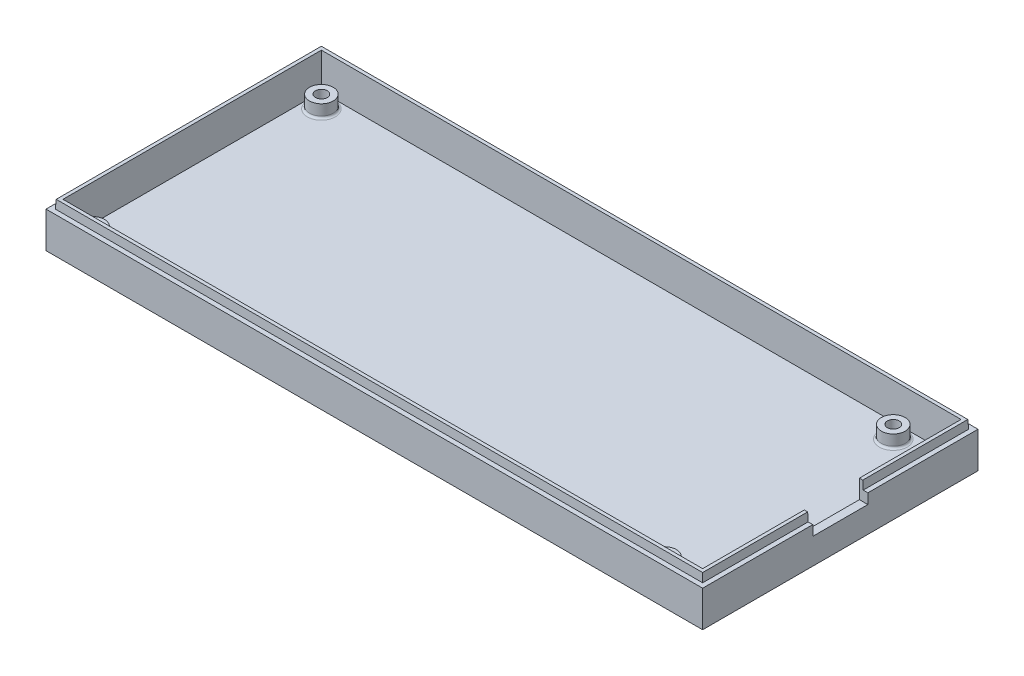
ISO-10303-21;
HEADER;
FILE_DESCRIPTION(('STEP AP214'),'2;1');
FILE_NAME('part.step','',(''),(''),'','','');
FILE_SCHEMA(('AUTOMOTIVE_DESIGN { 1 0 10303 214 1 1 1 1 }'));
ENDSEC;
DATA;
#1=APPLICATION_CONTEXT('core data for automotive mechanical design processes');
#2=APPLICATION_PROTOCOL_DEFINITION('international standard','automotive_design',2000,#1);
#3=PRODUCT_CONTEXT('',#1,'mechanical');
#4=PRODUCT('Part','Part','',(#3));
#5=PRODUCT_RELATED_PRODUCT_CATEGORY('part','',(#4));
#6=PRODUCT_DEFINITION_FORMATION('','',#4);
#7=PRODUCT_DEFINITION_CONTEXT('part definition',#1,'design');
#8=PRODUCT_DEFINITION('design','',#6,#7);
#9=PRODUCT_DEFINITION_SHAPE('','',#8);
#10=(LENGTH_UNIT() NAMED_UNIT(*) SI_UNIT(.MILLI.,.METRE.));
#11=(NAMED_UNIT(*) PLANE_ANGLE_UNIT() SI_UNIT($,.RADIAN.));
#12=(NAMED_UNIT(*) SI_UNIT($,.STERADIAN.) SOLID_ANGLE_UNIT());
#13=UNCERTAINTY_MEASURE_WITH_UNIT(LENGTH_MEASURE(1.E-05),#10,'distance_accuracy_value','');
#14=(GEOMETRIC_REPRESENTATION_CONTEXT(3) GLOBAL_UNCERTAINTY_ASSIGNED_CONTEXT((#13)) GLOBAL_UNIT_ASSIGNED_CONTEXT((#10,
#11,#12)) REPRESENTATION_CONTEXT('',''));
#15=CARTESIAN_POINT('',(0.,0.,0.));
#16=DIRECTION('',(0.,0.,1.));
#17=DIRECTION('',(1.,0.,0.));
#18=AXIS2_PLACEMENT_3D('',#15,#16,#17);
#19=CARTESIAN_POINT('',(0.,6.5,0.));
#20=DIRECTION('',(0.,-1.,0.));
#21=DIRECTION('',(0.,0.,-1.));
#22=AXIS2_PLACEMENT_3D('',#19,#20,#21);
#23=PLANE('',#22);
#24=DIRECTION('',(1.,0.,0.));
#25=VECTOR('',#24,1.);
#26=CARTESIAN_POINT('',(-77.501,6.5,6.49999999999998));
#27=LINE('',#26,#25);
#28=CARTESIAN_POINT('',(76.4,6.5,6.49999999999998));
#29=VERTEX_POINT('',#28);
#30=CARTESIAN_POINT('',(77.5,6.5,6.49999999999998));
#31=VERTEX_POINT('',#30);
#32=EDGE_CURVE('E44',#29,#31,#27,.T.);
#33=ORIENTED_EDGE('',*,*,#32,.F.);
#34=DIRECTION('',(0.,0.,1.));
#35=VECTOR('',#34,1.);
#36=CARTESIAN_POINT('',(76.4,6.5,0.));
#37=LINE('',#36,#35);
#38=CARTESIAN_POINT('',(76.4,6.5,31.4));
#39=VERTEX_POINT('',#38);
#40=EDGE_CURVE('E184',#29,#39,#37,.T.);
#41=ORIENTED_EDGE('',*,*,#40,.T.);
#42=DIRECTION('',(-1.,0.,0.));
#43=VECTOR('',#42,1.);
#44=CARTESIAN_POINT('',(0.,6.5,31.4));
#45=LINE('',#44,#43);
#46=CARTESIAN_POINT('',(-76.4,6.5,31.4));
#47=VERTEX_POINT('',#46);
#48=EDGE_CURVE('E222',#39,#47,#45,.T.);
#49=ORIENTED_EDGE('',*,*,#48,.T.);
#50=DIRECTION('',(0.,0.,-1.));
#51=VECTOR('',#50,1.);
#52=CARTESIAN_POINT('',(-76.4,6.5,0.));
#53=LINE('',#52,#51);
#54=CARTESIAN_POINT('',(-76.4,6.5,-31.4));
#55=VERTEX_POINT('',#54);
#56=EDGE_CURVE('E226',#47,#55,#53,.T.);
#57=ORIENTED_EDGE('',*,*,#56,.T.);
#58=DIRECTION('',(1.,0.,0.));
#59=VECTOR('',#58,1.);
#60=CARTESIAN_POINT('',(0.,6.5,-31.4));
#61=LINE('',#60,#59);
#62=CARTESIAN_POINT('',(76.4,6.5,-31.4));
#63=VERTEX_POINT('',#62);
#64=EDGE_CURVE('E207',#55,#63,#61,.T.);
#65=ORIENTED_EDGE('',*,*,#64,.T.);
#66=DIRECTION('',(0.,0.,1.));
#67=VECTOR('',#66,1.);
#68=CARTESIAN_POINT('',(76.4,6.5,0.));
#69=LINE('',#68,#67);
#70=CARTESIAN_POINT('',(76.4,6.5,-6.50000000000002));
#71=VERTEX_POINT('',#70);
#72=EDGE_CURVE('E210',#63,#71,#69,.T.);
#73=ORIENTED_EDGE('',*,*,#72,.T.);
#74=DIRECTION('',(1.,0.,0.));
#75=VECTOR('',#74,1.);
#76=CARTESIAN_POINT('',(-77.501,6.5,-6.50000000000002));
#77=LINE('',#76,#75);
#78=CARTESIAN_POINT('',(77.5,6.5,-6.50000000000002));
#79=VERTEX_POINT('',#78);
#80=EDGE_CURVE('E12',#71,#79,#77,.T.);
#81=ORIENTED_EDGE('',*,*,#80,.T.);
#82=DIRECTION('',(0.,0.,1.));
#83=VECTOR('',#82,1.);
#84=CARTESIAN_POINT('',(77.5,6.5,-30.5));
#85=LINE('',#84,#83);
#86=CARTESIAN_POINT('',(77.5,6.5,-32.5));
#87=VERTEX_POINT('',#86);
#88=EDGE_CURVE('E376',#87,#79,#85,.T.);
#89=ORIENTED_EDGE('',*,*,#88,.F.);
#90=DIRECTION('',(1.,0.,0.));
#91=VECTOR('',#90,1.);
#92=CARTESIAN_POINT('',(-75.5,6.5,-32.5));
#93=LINE('',#92,#91);
#94=CARTESIAN_POINT('',(-77.5,6.5,-32.5));
#95=VERTEX_POINT('',#94);
#96=EDGE_CURVE('E380',#95,#87,#93,.T.);
#97=ORIENTED_EDGE('',*,*,#96,.F.);
#98=DIRECTION('',(0.,0.,-1.));
#99=VECTOR('',#98,1.);
#100=CARTESIAN_POINT('',(-77.5,6.5,-30.5));
#101=LINE('',#100,#99);
#102=CARTESIAN_POINT('',(-77.5,6.5,32.5));
#103=VERTEX_POINT('',#102);
#104=EDGE_CURVE('E366',#103,#95,#101,.T.);
#105=ORIENTED_EDGE('',*,*,#104,.F.);
#106=DIRECTION('',(-1.,0.,0.));
#107=VECTOR('',#106,1.);
#108=CARTESIAN_POINT('',(-75.5,6.5,32.5));
#109=LINE('',#108,#107);
#110=CARTESIAN_POINT('',(77.5,6.5,32.5));
#111=VERTEX_POINT('',#110);
#112=EDGE_CURVE('E363',#111,#103,#109,.T.);
#113=ORIENTED_EDGE('',*,*,#112,.F.);
#114=EDGE_CURVE('E379',#31,#111,#85,.T.);
#115=ORIENTED_EDGE('',*,*,#114,.F.);
#116=EDGE_LOOP('',(#33,#41,#49,#57,#65,#73,#81,#89,#97,#105,#113,#115));
#117=FACE_BOUND('',#116,.T.);
#118=ADVANCED_FACE('F36',(#117),#23,.F.);
#119=CARTESIAN_POINT('',(0.,0.,0.));
#120=DIRECTION('',(0.,1.,0.));
#121=DIRECTION('',(0.,0.,1.));
#122=AXIS2_PLACEMENT_3D('',#119,#120,#121);
#123=PLANE('',#122);
#124=CARTESIAN_POINT('',(-72.,0.,-27.));
#125=DIRECTION('',(0.,1.,0.));
#126=DIRECTION('',(0.,0.,1.));
#127=AXIS2_PLACEMENT_3D('',#124,#125,#126);
#128=CIRCLE('',#127,1.4);
#129=CARTESIAN_POINT('',(-72.,0.,-25.6));
#130=VERTEX_POINT('',#129);
#131=EDGE_CURVE('E290',#130,#130,#128,.F.);
#132=ORIENTED_EDGE('',*,*,#131,.F.);
#133=EDGE_LOOP('',(#132));
#134=FACE_BOUND('',#133,.T.);
#135=ADVANCED_FACE('F456',(#134),#123,.T.);
#136=CARTESIAN_POINT('',(0.,0.,0.));
#137=DIRECTION('',(0.,1.,0.));
#138=DIRECTION('',(0.,0.,1.));
#139=AXIS2_PLACEMENT_3D('',#136,#137,#138);
#140=PLANE('',#139);
#141=CARTESIAN_POINT('',(63.,0.,-27.));
#142=DIRECTION('',(0.,1.,0.));
#143=DIRECTION('',(0.,0.,1.));
#144=AXIS2_PLACEMENT_3D('',#141,#142,#143);
#145=CIRCLE('',#144,1.4);
#146=CARTESIAN_POINT('',(63.,0.,-25.6));
#147=VERTEX_POINT('',#146);
#148=EDGE_CURVE('E273',#147,#147,#145,.F.);
#149=ORIENTED_EDGE('',*,*,#148,.F.);
#150=EDGE_LOOP('',(#149));
#151=FACE_BOUND('',#150,.T.);
#152=ADVANCED_FACE('F462',(#151),#140,.T.);
#153=CARTESIAN_POINT('',(0.,0.,0.));
#154=DIRECTION('',(0.,1.,0.));
#155=DIRECTION('',(0.,0.,1.));
#156=AXIS2_PLACEMENT_3D('',#153,#154,#155);
#157=PLANE('',#156);
#158=CARTESIAN_POINT('',(63.,0.,27.));
#159=DIRECTION('',(0.,1.,0.));
#160=DIRECTION('',(0.,0.,1.));
#161=AXIS2_PLACEMENT_3D('',#158,#159,#160);
#162=CIRCLE('',#161,1.4);
#163=CARTESIAN_POINT('',(63.,0.,28.4));
#164=VERTEX_POINT('',#163);
#165=EDGE_CURVE('E274',#164,#164,#162,.F.);
#166=ORIENTED_EDGE('',*,*,#165,.F.);
#167=EDGE_LOOP('',(#166));
#168=FACE_BOUND('',#167,.T.);
#169=ADVANCED_FACE('F680',(#168),#157,.T.);
#170=CARTESIAN_POINT('',(0.,0.,0.));
#171=DIRECTION('',(0.,1.,0.));
#172=DIRECTION('',(0.,0.,1.));
#173=AXIS2_PLACEMENT_3D('',#170,#171,#172);
#174=PLANE('',#173);
#175=CARTESIAN_POINT('',(-72.,0.,27.));
#176=DIRECTION('',(0.,1.,0.));
#177=DIRECTION('',(0.,0.,1.));
#178=AXIS2_PLACEMENT_3D('',#175,#176,#177);
#179=CIRCLE('',#178,1.4);
#180=CARTESIAN_POINT('',(-72.,0.,28.4));
#181=VERTEX_POINT('',#180);
#182=EDGE_CURVE('E281',#181,#181,#179,.F.);
#183=ORIENTED_EDGE('',*,*,#182,.F.);
#184=EDGE_LOOP('',(#183));
#185=FACE_BOUND('',#184,.T.);
#186=ADVANCED_FACE('F692',(#185),#174,.T.);
#187=CARTESIAN_POINT('',(-72.,-3.95979797464467,-27.));
#188=DIRECTION('',(0.,1.,0.));
#189=DIRECTION('',(0.,0.,1.));
#190=AXIS2_PLACEMENT_3D('',#187,#188,#189);
#191=CYLINDRICAL_SURFACE('',#190,1.4);
#192=ORIENTED_EDGE('',*,*,#131,.T.);
#193=EDGE_LOOP('',(#192));
#194=FACE_BOUND('',#193,.T.);
#195=CARTESIAN_POINT('',(-72.,3.,-27.));
#196=DIRECTION('',(0.,1.,0.));
#197=DIRECTION('',(0.,0.,1.));
#198=AXIS2_PLACEMENT_3D('',#195,#196,#197);
#199=CIRCLE('',#198,1.4);
#200=CARTESIAN_POINT('',(-72.,3.,-25.6));
#201=VERTEX_POINT('',#200);
#202=EDGE_CURVE('E277',#201,#201,#199,.T.);
#203=ORIENTED_EDGE('',*,*,#202,.T.);
#204=EDGE_LOOP('',(#203));
#205=FACE_BOUND('',#204,.T.);
#206=ADVANCED_FACE('F531',(#194,#205),#191,.F.);
#207=CARTESIAN_POINT('',(63.,-3.95979797464467,-27.));
#208=DIRECTION('',(0.,1.,0.));
#209=DIRECTION('',(0.,0.,1.));
#210=AXIS2_PLACEMENT_3D('',#207,#208,#209);
#211=CYLINDRICAL_SURFACE('',#210,1.4);
#212=ORIENTED_EDGE('',*,*,#148,.T.);
#213=EDGE_LOOP('',(#212));
#214=FACE_BOUND('',#213,.T.);
#215=CARTESIAN_POINT('',(63.,3.,-27.));
#216=DIRECTION('',(0.,1.,0.));
#217=DIRECTION('',(0.,0.,1.));
#218=AXIS2_PLACEMENT_3D('',#215,#216,#217);
#219=CIRCLE('',#218,1.4);
#220=CARTESIAN_POINT('',(63.,3.,-25.6));
#221=VERTEX_POINT('',#220);
#222=EDGE_CURVE('E270',#221,#221,#219,.T.);
#223=ORIENTED_EDGE('',*,*,#222,.T.);
#224=EDGE_LOOP('',(#223));
#225=FACE_BOUND('',#224,.T.);
#226=ADVANCED_FACE('F691',(#214,#225),#211,.F.);
#227=CARTESIAN_POINT('',(63.,-3.95979797464467,27.));
#228=DIRECTION('',(0.,1.,0.));
#229=DIRECTION('',(0.,0.,1.));
#230=AXIS2_PLACEMENT_3D('',#227,#228,#229);
#231=CYLINDRICAL_SURFACE('',#230,1.4);
#232=ORIENTED_EDGE('',*,*,#165,.T.);
#233=EDGE_LOOP('',(#232));
#234=FACE_BOUND('',#233,.T.);
#235=CARTESIAN_POINT('',(63.,3.,27.));
#236=DIRECTION('',(0.,1.,0.));
#237=DIRECTION('',(0.,0.,1.));
#238=AXIS2_PLACEMENT_3D('',#235,#236,#237);
#239=CIRCLE('',#238,1.4);
#240=CARTESIAN_POINT('',(63.,3.,28.4));
#241=VERTEX_POINT('',#240);
#242=EDGE_CURVE('E278',#241,#241,#239,.T.);
#243=ORIENTED_EDGE('',*,*,#242,.T.);
#244=EDGE_LOOP('',(#243));
#245=FACE_BOUND('',#244,.T.);
#246=ADVANCED_FACE('F526',(#234,#245),#231,.F.);
#247=CARTESIAN_POINT('',(-72.,-3.95979797464467,27.));
#248=DIRECTION('',(0.,1.,0.));
#249=DIRECTION('',(0.,0.,1.));
#250=AXIS2_PLACEMENT_3D('',#247,#248,#249);
#251=CYLINDRICAL_SURFACE('',#250,1.4);
#252=ORIENTED_EDGE('',*,*,#182,.T.);
#253=EDGE_LOOP('',(#252));
#254=FACE_BOUND('',#253,.T.);
#255=CARTESIAN_POINT('',(-72.,3.,27.));
#256=DIRECTION('',(0.,1.,0.));
#257=DIRECTION('',(0.,0.,1.));
#258=AXIS2_PLACEMENT_3D('',#255,#256,#257);
#259=CIRCLE('',#258,1.4);
#260=CARTESIAN_POINT('',(-72.,3.,28.4));
#261=VERTEX_POINT('',#260);
#262=EDGE_CURVE('E254',#261,#261,#259,.T.);
#263=ORIENTED_EDGE('',*,*,#262,.T.);
#264=EDGE_LOOP('',(#263));
#265=FACE_BOUND('',#264,.T.);
#266=ADVANCED_FACE('F516',(#254,#265),#251,.F.);
#267=CARTESIAN_POINT('',(-72.,3.,-27.));
#268=DIRECTION('',(0.,1.,0.));
#269=DIRECTION('',(0.,0.,1.));
#270=AXIS2_PLACEMENT_3D('',#267,#268,#269);
#271=PLANE('',#270);
#272=ORIENTED_EDGE('',*,*,#202,.F.);
#273=EDGE_LOOP('',(#272));
#274=FACE_BOUND('',#273,.T.);
#275=CARTESIAN_POINT('',(-72.,3.,-27.));
#276=DIRECTION('',(0.,1.,0.));
#277=DIRECTION('',(0.,0.,1.));
#278=AXIS2_PLACEMENT_3D('',#275,#276,#277);
#279=CIRCLE('',#278,2.80000000000001);
#280=CARTESIAN_POINT('',(-72.,3.,-24.2));
#281=VERTEX_POINT('',#280);
#282=EDGE_CURVE('E293',#281,#281,#279,.T.);
#283=ORIENTED_EDGE('',*,*,#282,.T.);
#284=EDGE_LOOP('',(#283));
#285=FACE_BOUND('',#284,.T.);
#286=ADVANCED_FACE('F513',(#274,#285),#271,.T.);
#287=CARTESIAN_POINT('',(63.,3.,-27.));
#288=DIRECTION('',(0.,1.,0.));
#289=DIRECTION('',(0.,0.,1.));
#290=AXIS2_PLACEMENT_3D('',#287,#288,#289);
#291=PLANE('',#290);
#292=ORIENTED_EDGE('',*,*,#222,.F.);
#293=EDGE_LOOP('',(#292));
#294=FACE_BOUND('',#293,.T.);
#295=CARTESIAN_POINT('',(63.,3.,-27.));
#296=DIRECTION('',(0.,1.,0.));
#297=DIRECTION('',(0.,0.,1.));
#298=AXIS2_PLACEMENT_3D('',#295,#296,#297);
#299=CIRCLE('',#298,2.80000000000001);
#300=CARTESIAN_POINT('',(63.,3.,-24.2));
#301=VERTEX_POINT('',#300);
#302=EDGE_CURVE('E302',#301,#301,#299,.T.);
#303=ORIENTED_EDGE('',*,*,#302,.T.);
#304=EDGE_LOOP('',(#303));
#305=FACE_BOUND('',#304,.T.);
#306=ADVANCED_FACE('F515',(#294,#305),#291,.T.);
#307=CARTESIAN_POINT('',(63.,3.,27.));
#308=DIRECTION('',(0.,-1.,0.));
#309=DIRECTION('',(0.,0.,-1.));
#310=AXIS2_PLACEMENT_3D('',#307,#308,#309);
#311=PLANE('',#310);
#312=ORIENTED_EDGE('',*,*,#242,.F.);
#313=EDGE_LOOP('',(#312));
#314=FACE_BOUND('',#313,.T.);
#315=CARTESIAN_POINT('',(63.,3.,27.));
#316=DIRECTION('',(0.,1.,0.));
#317=DIRECTION('',(0.,0.,-1.));
#318=AXIS2_PLACEMENT_3D('',#315,#316,#317);
#319=CIRCLE('',#318,2.80000000000001);
#320=CARTESIAN_POINT('',(63.,3.,24.2));
#321=VERTEX_POINT('',#320);
#322=EDGE_CURVE('E299',#321,#321,#319,.T.);
#323=ORIENTED_EDGE('',*,*,#322,.T.);
#324=EDGE_LOOP('',(#323));
#325=FACE_BOUND('',#324,.T.);
#326=ADVANCED_FACE('F523',(#314,#325),#311,.F.);
#327=CARTESIAN_POINT('',(-72.,3.,27.));
#328=DIRECTION('',(0.,-1.,0.));
#329=DIRECTION('',(0.,0.,-1.));
#330=AXIS2_PLACEMENT_3D('',#327,#328,#329);
#331=PLANE('',#330);
#332=ORIENTED_EDGE('',*,*,#262,.F.);
#333=EDGE_LOOP('',(#332));
#334=FACE_BOUND('',#333,.T.);
#335=CARTESIAN_POINT('',(-72.,3.,27.));
#336=DIRECTION('',(0.,1.,0.));
#337=DIRECTION('',(0.,0.,-1.));
#338=AXIS2_PLACEMENT_3D('',#335,#336,#337);
#339=CIRCLE('',#338,2.80000000000001);
#340=CARTESIAN_POINT('',(-72.,3.,24.2));
#341=VERTEX_POINT('',#340);
#342=EDGE_CURVE('E296',#341,#341,#339,.T.);
#343=ORIENTED_EDGE('',*,*,#342,.T.);
#344=EDGE_LOOP('',(#343));
#345=FACE_BOUND('',#344,.T.);
#346=ADVANCED_FACE('F509',(#334,#345),#331,.F.);
#347=CARTESIAN_POINT('',(-72.,3.,-27.));
#348=DIRECTION('',(0.,-1.,0.));
#349=DIRECTION('',(0.,0.,-1.));
#350=AXIS2_PLACEMENT_3D('',#347,#348,#349);
#351=CYLINDRICAL_SURFACE('',#350,2.80000000000001);
#352=CARTESIAN_POINT('',(-72.,0.5,-27.));
#353=DIRECTION('',(0.,1.,0.));
#354=DIRECTION('',(0.,0.,1.));
#355=AXIS2_PLACEMENT_3D('',#352,#353,#354);
#356=CIRCLE('',#355,2.80000000000001);
#357=CARTESIAN_POINT('',(-72.,0.5,-24.2));
#358=VERTEX_POINT('',#357);
#359=EDGE_CURVE('E360',#358,#358,#356,.T.);
#360=ORIENTED_EDGE('',*,*,#359,.T.);
#361=EDGE_LOOP('',(#360));
#362=FACE_BOUND('',#361,.T.);
#363=ORIENTED_EDGE('',*,*,#282,.F.);
#364=EDGE_LOOP('',(#363));
#365=FACE_BOUND('',#364,.T.);
#366=ADVANCED_FACE('F505',(#362,#365),#351,.T.);
#367=CARTESIAN_POINT('',(63.,3.,-27.));
#368=DIRECTION('',(0.,-1.,0.));
#369=DIRECTION('',(0.,0.,-1.));
#370=AXIS2_PLACEMENT_3D('',#367,#368,#369);
#371=CYLINDRICAL_SURFACE('',#370,2.80000000000001);
#372=CARTESIAN_POINT('',(63.,0.5,-27.));
#373=DIRECTION('',(0.,1.,0.));
#374=DIRECTION('',(0.,0.,1.));
#375=AXIS2_PLACEMENT_3D('',#372,#373,#374);
#376=CIRCLE('',#375,2.80000000000001);
#377=CARTESIAN_POINT('',(63.,0.5,-24.2));
#378=VERTEX_POINT('',#377);
#379=EDGE_CURVE('E357',#378,#378,#376,.T.);
#380=ORIENTED_EDGE('',*,*,#379,.T.);
#381=EDGE_LOOP('',(#380));
#382=FACE_BOUND('',#381,.T.);
#383=ORIENTED_EDGE('',*,*,#302,.F.);
#384=EDGE_LOOP('',(#383));
#385=FACE_BOUND('',#384,.T.);
#386=ADVANCED_FACE('F508',(#382,#385),#371,.T.);
#387=CARTESIAN_POINT('',(63.,3.,27.));
#388=DIRECTION('',(0.,-1.,0.));
#389=DIRECTION('',(0.,0.,-1.));
#390=AXIS2_PLACEMENT_3D('',#387,#388,#389);
#391=CYLINDRICAL_SURFACE('',#390,2.80000000000001);
#392=CARTESIAN_POINT('',(63.,0.5,27.));
#393=DIRECTION('',(0.,1.,0.));
#394=DIRECTION('',(0.,0.,1.));
#395=AXIS2_PLACEMENT_3D('',#392,#393,#394);
#396=CIRCLE('',#395,2.80000000000001);
#397=CARTESIAN_POINT('',(63.,0.5,29.8));
#398=VERTEX_POINT('',#397);
#399=EDGE_CURVE('E354',#398,#398,#396,.T.);
#400=ORIENTED_EDGE('',*,*,#399,.T.);
#401=EDGE_LOOP('',(#400));
#402=FACE_BOUND('',#401,.T.);
#403=ORIENTED_EDGE('',*,*,#322,.F.);
#404=EDGE_LOOP('',(#403));
#405=FACE_BOUND('',#404,.T.);
#406=ADVANCED_FACE('F498',(#402,#405),#391,.T.);
#407=CARTESIAN_POINT('',(-72.,3.,27.));
#408=DIRECTION('',(0.,-1.,0.));
#409=DIRECTION('',(0.,0.,-1.));
#410=AXIS2_PLACEMENT_3D('',#407,#408,#409);
#411=CYLINDRICAL_SURFACE('',#410,2.80000000000001);
#412=CARTESIAN_POINT('',(-72.,0.5,27.));
#413=DIRECTION('',(0.,1.,0.));
#414=DIRECTION('',(0.,0.,1.));
#415=AXIS2_PLACEMENT_3D('',#412,#413,#414);
#416=CIRCLE('',#415,2.80000000000001);
#417=CARTESIAN_POINT('',(-72.,0.5,29.8));
#418=VERTEX_POINT('',#417);
#419=EDGE_CURVE('E328',#418,#418,#416,.T.);
#420=ORIENTED_EDGE('',*,*,#419,.T.);
#421=EDGE_LOOP('',(#420));
#422=FACE_BOUND('',#421,.T.);
#423=ORIENTED_EDGE('',*,*,#342,.F.);
#424=EDGE_LOOP('',(#423));
#425=FACE_BOUND('',#424,.T.);
#426=ADVANCED_FACE('F493',(#422,#425),#411,.T.);
#427=CARTESIAN_POINT('',(-72.,0.5,-27.));
#428=DIRECTION('',(0.,1.,0.));
#429=DIRECTION('',(0.,0.,1.));
#430=AXIS2_PLACEMENT_3D('',#427,#428,#429);
#431=TOROIDAL_SURFACE('',#430,3.30000000000001,0.5);
#432=CARTESIAN_POINT('',(-72.,0.,-27.));
#433=DIRECTION('',(0.,1.,0.));
#434=DIRECTION('',(0.,0.,1.));
#435=AXIS2_PLACEMENT_3D('',#432,#433,#434);
#436=CIRCLE('',#435,3.30000000000001);
#437=CARTESIAN_POINT('',(-72.,0.,-23.7));
#438=VERTEX_POINT('',#437);
#439=EDGE_CURVE('E342',#438,#438,#436,.F.);
#440=ORIENTED_EDGE('',*,*,#439,.F.);
#441=EDGE_LOOP('',(#440));
#442=FACE_BOUND('',#441,.T.);
#443=ORIENTED_EDGE('',*,*,#359,.F.);
#444=EDGE_LOOP('',(#443));
#445=FACE_BOUND('',#444,.T.);
#446=ADVANCED_FACE('F490',(#442,#445),#431,.F.);
#447=CARTESIAN_POINT('',(63.,0.5,-27.));
#448=DIRECTION('',(0.,1.,0.));
#449=DIRECTION('',(0.,0.,1.));
#450=AXIS2_PLACEMENT_3D('',#447,#448,#449);
#451=TOROIDAL_SURFACE('',#450,3.30000000000001,0.5);
#452=CARTESIAN_POINT('',(63.,0.,-27.));
#453=DIRECTION('',(0.,1.,0.));
#454=DIRECTION('',(0.,0.,1.));
#455=AXIS2_PLACEMENT_3D('',#452,#453,#454);
#456=CIRCLE('',#455,3.30000000000001);
#457=CARTESIAN_POINT('',(63.,0.,-23.7));
#458=VERTEX_POINT('',#457);
#459=EDGE_CURVE('E345',#458,#458,#456,.F.);
#460=ORIENTED_EDGE('',*,*,#459,.F.);
#461=EDGE_LOOP('',(#460));
#462=FACE_BOUND('',#461,.T.);
#463=ORIENTED_EDGE('',*,*,#379,.F.);
#464=EDGE_LOOP('',(#463));
#465=FACE_BOUND('',#464,.T.);
#466=ADVANCED_FACE('F487',(#462,#465),#451,.F.);
#467=CARTESIAN_POINT('',(63.,0.5,27.));
#468=DIRECTION('',(0.,1.,0.));
#469=DIRECTION('',(0.,0.,1.));
#470=AXIS2_PLACEMENT_3D('',#467,#468,#469);
#471=TOROIDAL_SURFACE('',#470,3.30000000000001,0.5);
#472=CARTESIAN_POINT('',(63.,0.,27.));
#473=DIRECTION('',(0.,1.,0.));
#474=DIRECTION('',(0.,0.,1.));
#475=AXIS2_PLACEMENT_3D('',#472,#473,#474);
#476=CIRCLE('',#475,3.30000000000001);
#477=CARTESIAN_POINT('',(63.,0.,30.3));
#478=VERTEX_POINT('',#477);
#479=EDGE_CURVE('E348',#478,#478,#476,.F.);
#480=ORIENTED_EDGE('',*,*,#479,.F.);
#481=EDGE_LOOP('',(#480));
#482=FACE_BOUND('',#481,.T.);
#483=ORIENTED_EDGE('',*,*,#399,.F.);
#484=EDGE_LOOP('',(#483));
#485=FACE_BOUND('',#484,.T.);
#486=ADVANCED_FACE('F483',(#482,#485),#471,.F.);
#487=CARTESIAN_POINT('',(-72.,0.5,27.));
#488=DIRECTION('',(0.,1.,0.));
#489=DIRECTION('',(0.,0.,1.));
#490=AXIS2_PLACEMENT_3D('',#487,#488,#489);
#491=TOROIDAL_SURFACE('',#490,3.30000000000001,0.5);
#492=CARTESIAN_POINT('',(-72.,0.,27.));
#493=DIRECTION('',(0.,1.,0.));
#494=DIRECTION('',(0.,0.,1.));
#495=AXIS2_PLACEMENT_3D('',#492,#493,#494);
#496=CIRCLE('',#495,3.30000000000001);
#497=CARTESIAN_POINT('',(-72.,0.,30.3));
#498=VERTEX_POINT('',#497);
#499=EDGE_CURVE('E351',#498,#498,#496,.F.);
#500=ORIENTED_EDGE('',*,*,#499,.F.);
#501=EDGE_LOOP('',(#500));
#502=FACE_BOUND('',#501,.T.);
#503=ORIENTED_EDGE('',*,*,#419,.F.);
#504=EDGE_LOOP('',(#503));
#505=FACE_BOUND('',#504,.T.);
#506=ADVANCED_FACE('F480',(#502,#505),#491,.F.);
#507=CARTESIAN_POINT('',(-75.5,13.,-30.5));
#508=DIRECTION('',(0.,0.,1.));
#509=DIRECTION('',(1.,0.,0.));
#510=AXIS2_PLACEMENT_3D('',#507,#508,#509);
#511=PLANE('',#510);
#512=DIRECTION('',(0.,-1.,0.));
#513=VECTOR('',#512,1.);
#514=CARTESIAN_POINT('',(75.5,13.,-30.5));
#515=LINE('',#514,#513);
#516=CARTESIAN_POINT('',(75.5,8.5,-30.5));
#517=VERTEX_POINT('',#516);
#518=CARTESIAN_POINT('',(75.5,0.,-30.5));
#519=VERTEX_POINT('',#518);
#520=EDGE_CURVE('E162',#517,#519,#515,.T.);
#521=ORIENTED_EDGE('',*,*,#520,.F.);
#522=DIRECTION('',(1.,0.,0.));
#523=VECTOR('',#522,1.);
#524=CARTESIAN_POINT('',(-75.5,8.5,-30.5));
#525=LINE('',#524,#523);
#526=CARTESIAN_POINT('',(-75.5,8.5,-30.5));
#527=VERTEX_POINT('',#526);
#528=EDGE_CURVE('E165',#527,#517,#525,.T.);
#529=ORIENTED_EDGE('',*,*,#528,.F.);
#530=DIRECTION('',(0.,-1.,0.));
#531=VECTOR('',#530,1.);
#532=CARTESIAN_POINT('',(-75.5,13.,-30.5));
#533=LINE('',#532,#531);
#534=CARTESIAN_POINT('',(-75.5,0.,-30.5));
#535=VERTEX_POINT('',#534);
#536=EDGE_CURVE('E332',#527,#535,#533,.T.);
#537=ORIENTED_EDGE('',*,*,#536,.T.);
#538=DIRECTION('',(-1.,0.,0.));
#539=VECTOR('',#538,1.);
#540=CARTESIAN_POINT('',(-75.5,0.,-30.5));
#541=LINE('',#540,#539);
#542=EDGE_CURVE('E167',#519,#535,#541,.T.);
#543=ORIENTED_EDGE('',*,*,#542,.F.);
#544=EDGE_LOOP('',(#521,#529,#537,#543));
#545=FACE_BOUND('',#544,.T.);
#546=ADVANCED_FACE('F164',(#545),#511,.T.);
#547=CARTESIAN_POINT('',(-75.5,13.,-30.5));
#548=DIRECTION('',(1.,0.,0.));
#549=DIRECTION('',(0.,0.,-1.));
#550=AXIS2_PLACEMENT_3D('',#547,#548,#549);
#551=PLANE('',#550);
#552=ORIENTED_EDGE('',*,*,#536,.F.);
#553=DIRECTION('',(0.,0.,-1.));
#554=VECTOR('',#553,1.);
#555=CARTESIAN_POINT('',(-75.5,8.5,-30.5));
#556=LINE('',#555,#554);
#557=CARTESIAN_POINT('',(-75.5,8.5,30.5));
#558=VERTEX_POINT('',#557);
#559=EDGE_CURVE('E183',#558,#527,#556,.T.);
#560=ORIENTED_EDGE('',*,*,#559,.F.);
#561=DIRECTION('',(0.,-1.,0.));
#562=VECTOR('',#561,1.);
#563=CARTESIAN_POINT('',(-75.5,13.,30.5));
#564=LINE('',#563,#562);
#565=CARTESIAN_POINT('',(-75.5,0.,30.5));
#566=VERTEX_POINT('',#565);
#567=EDGE_CURVE('E326',#558,#566,#564,.T.);
#568=ORIENTED_EDGE('',*,*,#567,.T.);
#569=DIRECTION('',(0.,0.,1.));
#570=VECTOR('',#569,1.);
#571=CARTESIAN_POINT('',(-75.5,0.,-30.5));
#572=LINE('',#571,#570);
#573=EDGE_CURVE('E172',#535,#566,#572,.T.);
#574=ORIENTED_EDGE('',*,*,#573,.F.);
#575=EDGE_LOOP('',(#552,#560,#568,#574));
#576=FACE_BOUND('',#575,.T.);
#577=ADVANCED_FACE('F474',(#576),#551,.T.);
#578=CARTESIAN_POINT('',(0.,0.,0.));
#579=DIRECTION('',(0.,1.,0.));
#580=DIRECTION('',(0.,0.,1.));
#581=AXIS2_PLACEMENT_3D('',#578,#579,#580);
#582=PLANE('',#581);
#583=ORIENTED_EDGE('',*,*,#499,.T.);
#584=EDGE_LOOP('',(#583));
#585=FACE_BOUND('',#584,.T.);
#586=ORIENTED_EDGE('',*,*,#479,.T.);
#587=EDGE_LOOP('',(#586));
#588=FACE_BOUND('',#587,.T.);
#589=ORIENTED_EDGE('',*,*,#459,.T.);
#590=EDGE_LOOP('',(#589));
#591=FACE_BOUND('',#590,.T.);
#592=ORIENTED_EDGE('',*,*,#439,.T.);
#593=EDGE_LOOP('',(#592));
#594=FACE_BOUND('',#593,.T.);
#595=DIRECTION('',(0.,0.,-1.));
#596=VECTOR('',#595,1.);
#597=CARTESIAN_POINT('',(75.5,0.,-30.5));
#598=LINE('',#597,#596);
#599=CARTESIAN_POINT('',(75.5,0.,30.5));
#600=VERTEX_POINT('',#599);
#601=EDGE_CURVE('E311',#600,#519,#598,.T.);
#602=ORIENTED_EDGE('',*,*,#601,.T.);
#603=ORIENTED_EDGE('',*,*,#542,.T.);
#604=ORIENTED_EDGE('',*,*,#573,.T.);
#605=DIRECTION('',(1.,0.,0.));
#606=VECTOR('',#605,1.);
#607=CARTESIAN_POINT('',(-75.5,0.,30.5));
#608=LINE('',#607,#606);
#609=EDGE_CURVE('E329',#566,#600,#608,.T.);
#610=ORIENTED_EDGE('',*,*,#609,.T.);
#611=EDGE_LOOP('',(#602,#603,#604,#610));
#612=FACE_BOUND('',#611,.T.);
#613=ADVANCED_FACE('F476',(#585,#588,#591,#594,#612),#582,.T.);
#614=CARTESIAN_POINT('',(75.5,13.,-30.5));
#615=DIRECTION('',(-1.,0.,0.));
#616=DIRECTION('',(0.,0.,1.));
#617=AXIS2_PLACEMENT_3D('',#614,#615,#616);
#618=PLANE('',#617);
#619=DIRECTION('',(0.,-1.,0.));
#620=VECTOR('',#619,1.);
#621=CARTESIAN_POINT('',(75.5,0.,-6.50000000000002));
#622=LINE('',#621,#620);
#623=CARTESIAN_POINT('',(75.5,8.5,-6.50000000000002));
#624=VERTEX_POINT('',#623);
#625=CARTESIAN_POINT('',(75.4999999999999,4.10000000000001,-6.50000000000002));
#626=VERTEX_POINT('',#625);
#627=EDGE_CURVE('E188',#624,#626,#622,.T.);
#628=ORIENTED_EDGE('',*,*,#627,.F.);
#629=DIRECTION('',(0.,0.,1.));
#630=VECTOR('',#629,1.);
#631=CARTESIAN_POINT('',(75.5,8.5,-30.5));
#632=LINE('',#631,#630);
#633=EDGE_CURVE('E179',#517,#624,#632,.T.);
#634=ORIENTED_EDGE('',*,*,#633,.F.);
#635=ORIENTED_EDGE('',*,*,#520,.T.);
#636=ORIENTED_EDGE('',*,*,#601,.F.);
#637=DIRECTION('',(0.,-1.,0.));
#638=VECTOR('',#637,1.);
#639=CARTESIAN_POINT('',(75.5,13.,30.5));
#640=LINE('',#639,#638);
#641=CARTESIAN_POINT('',(75.5,8.5,30.5));
#642=VERTEX_POINT('',#641);
#643=EDGE_CURVE('E337',#642,#600,#640,.T.);
#644=ORIENTED_EDGE('',*,*,#643,.F.);
#645=CARTESIAN_POINT('',(75.5,8.5,6.49999999999998));
#646=VERTEX_POINT('',#645);
#647=EDGE_CURVE('E191',#646,#642,#632,.T.);
#648=ORIENTED_EDGE('',*,*,#647,.F.);
#649=DIRECTION('',(0.,-1.,0.));
#650=VECTOR('',#649,1.);
#651=CARTESIAN_POINT('',(75.5,0.,6.49999999999998));
#652=LINE('',#651,#650);
#653=CARTESIAN_POINT('',(75.4999999999999,4.1,6.49999999999998));
#654=VERTEX_POINT('',#653);
#655=EDGE_CURVE('E264',#646,#654,#652,.T.);
#656=ORIENTED_EDGE('',*,*,#655,.T.);
#657=DIRECTION('',(0.,0.,-1.));
#658=VECTOR('',#657,1.);
#659=CARTESIAN_POINT('',(75.5,4.1,0.));
#660=LINE('',#659,#658);
#661=EDGE_CURVE('E260',#654,#626,#660,.T.);
#662=ORIENTED_EDGE('',*,*,#661,.T.);
#663=EDGE_LOOP('',(#628,#634,#635,#636,#644,#648,#656,#662));
#664=FACE_BOUND('',#663,.T.);
#665=ADVANCED_FACE('F186',(#664),#618,.T.);
#666=CARTESIAN_POINT('',(-77.501,0.,6.49999999999998));
#667=DIRECTION('',(0.,0.,1.));
#668=DIRECTION('',(0.,-1.,0.));
#669=AXIS2_PLACEMENT_3D('',#666,#667,#668);
#670=PLANE('',#669);
#671=ORIENTED_EDGE('',*,*,#655,.F.);
#672=DIRECTION('',(1.,0.,0.));
#673=VECTOR('',#672,1.);
#674=CARTESIAN_POINT('',(-77.501,8.5,6.49999999999998));
#675=LINE('',#674,#673);
#676=CARTESIAN_POINT('',(76.2951844414339,8.5,6.49999999999998));
#677=VERTEX_POINT('',#676);
#678=EDGE_CURVE('E192',#646,#677,#675,.T.);
#679=ORIENTED_EDGE('',*,*,#678,.T.);
#680=DIRECTION('',(0.0523359562429438,-0.998629534754574,0.));
#681=VECTOR('',#680,1.);
#682=CARTESIAN_POINT('',(75.8739286462687,16.5380394080458,6.49999999999998));
#683=LINE('',#682,#681);
#684=EDGE_CURVE('E215',#677,#29,#683,.T.);
#685=ORIENTED_EDGE('',*,*,#684,.T.);
#686=ORIENTED_EDGE('',*,*,#32,.T.);
#687=DIRECTION('',(0.,-1.,0.));
#688=VECTOR('',#687,1.);
#689=CARTESIAN_POINT('',(77.5,0.,6.49999999999998));
#690=LINE('',#689,#688);
#691=CARTESIAN_POINT('',(77.5,4.1,6.49999999999998));
#692=VERTEX_POINT('',#691);
#693=EDGE_CURVE('E255',#31,#692,#690,.T.);
#694=ORIENTED_EDGE('',*,*,#693,.T.);
#695=DIRECTION('',(1.,0.,0.));
#696=VECTOR('',#695,1.);
#697=CARTESIAN_POINT('',(-77.501,4.1,6.49999999999998));
#698=LINE('',#697,#696);
#699=EDGE_CURVE('E257',#654,#692,#698,.T.);
#700=ORIENTED_EDGE('',*,*,#699,.F.);
#701=EDGE_LOOP('',(#671,#679,#685,#686,#694,#700));
#702=FACE_BOUND('',#701,.T.);
#703=ADVANCED_FACE('F425',(#702),#670,.F.);
#704=CARTESIAN_POINT('',(-77.501,4.1,0.));
#705=DIRECTION('',(0.,-1.,0.));
#706=DIRECTION('',(0.,0.,-1.));
#707=AXIS2_PLACEMENT_3D('',#704,#705,#706);
#708=PLANE('',#707);
#709=ORIENTED_EDGE('',*,*,#699,.T.);
#710=DIRECTION('',(0.,0.,-1.));
#711=VECTOR('',#710,1.);
#712=CARTESIAN_POINT('',(77.5,4.1,0.));
#713=LINE('',#712,#711);
#714=CARTESIAN_POINT('',(77.5,4.10000000000001,-6.50000000000002));
#715=VERTEX_POINT('',#714);
#716=EDGE_CURVE('E251',#692,#715,#713,.T.);
#717=ORIENTED_EDGE('',*,*,#716,.T.);
#718=DIRECTION('',(1.,0.,0.));
#719=VECTOR('',#718,1.);
#720=CARTESIAN_POINT('',(-77.501,4.10000000000001,-6.50000000000002));
#721=LINE('',#720,#719);
#722=EDGE_CURVE('E263',#626,#715,#721,.T.);
#723=ORIENTED_EDGE('',*,*,#722,.F.);
#724=ORIENTED_EDGE('',*,*,#661,.F.);
#725=EDGE_LOOP('',(#709,#717,#723,#724));
#726=FACE_BOUND('',#725,.T.);
#727=ADVANCED_FACE('F428',(#726),#708,.F.);
#728=CARTESIAN_POINT('',(-77.501,0.,-6.50000000000002));
#729=DIRECTION('',(0.,0.,1.));
#730=DIRECTION('',(0.,-1.,0.));
#731=AXIS2_PLACEMENT_3D('',#728,#729,#730);
#732=PLANE('',#731);
#733=ORIENTED_EDGE('',*,*,#80,.F.);
#734=DIRECTION('',(0.0523359562429438,-0.998629534754574,0.));
#735=VECTOR('',#734,1.);
#736=CARTESIAN_POINT('',(75.8739286462687,16.5380394080458,-6.50000000000002));
#737=LINE('',#736,#735);
#738=CARTESIAN_POINT('',(76.2951844414339,8.5,-6.50000000000002));
#739=VERTEX_POINT('',#738);
#740=EDGE_CURVE('E52',#739,#71,#737,.T.);
#741=ORIENTED_EDGE('',*,*,#740,.F.);
#742=DIRECTION('',(1.,0.,0.));
#743=VECTOR('',#742,1.);
#744=CARTESIAN_POINT('',(-77.501,8.5,-6.50000000000002));
#745=LINE('',#744,#743);
#746=EDGE_CURVE('E189',#624,#739,#745,.T.);
#747=ORIENTED_EDGE('',*,*,#746,.F.);
#748=ORIENTED_EDGE('',*,*,#627,.T.);
#749=ORIENTED_EDGE('',*,*,#722,.T.);
#750=DIRECTION('',(0.,-1.,0.));
#751=VECTOR('',#750,1.);
#752=CARTESIAN_POINT('',(77.5,0.,-6.50000000000002));
#753=LINE('',#752,#751);
#754=EDGE_CURVE('E258',#79,#715,#753,.T.);
#755=ORIENTED_EDGE('',*,*,#754,.F.);
#756=EDGE_LOOP('',(#733,#741,#747,#748,#749,#755));
#757=FACE_BOUND('',#756,.T.);
#758=ADVANCED_FACE('F549',(#757),#732,.T.);
#759=CARTESIAN_POINT('',(-75.5,13.,-32.5));
#760=DIRECTION('',(0.,0.,1.));
#761=DIRECTION('',(1.,0.,0.));
#762=AXIS2_PLACEMENT_3D('',#759,#760,#761);
#763=PLANE('',#762);
#764=DIRECTION('',(0.,-1.,0.));
#765=VECTOR('',#764,1.);
#766=CARTESIAN_POINT('',(-77.5,13.,-32.5));
#767=LINE('',#766,#765);
#768=CARTESIAN_POINT('',(-77.5,-2.,-32.5));
#769=VERTEX_POINT('',#768);
#770=EDGE_CURVE('E312',#95,#769,#767,.T.);
#771=ORIENTED_EDGE('',*,*,#770,.F.);
#772=ORIENTED_EDGE('',*,*,#96,.T.);
#773=DIRECTION('',(0.,-1.,0.));
#774=VECTOR('',#773,1.);
#775=CARTESIAN_POINT('',(77.5,13.,-32.5));
#776=LINE('',#775,#774);
#777=CARTESIAN_POINT('',(77.5,-2.,-32.5));
#778=VERTEX_POINT('',#777);
#779=EDGE_CURVE('E309',#87,#778,#776,.T.);
#780=ORIENTED_EDGE('',*,*,#779,.T.);
#781=DIRECTION('',(-1.,0.,0.));
#782=VECTOR('',#781,1.);
#783=CARTESIAN_POINT('',(-75.5,-2.,-32.5));
#784=LINE('',#783,#782);
#785=EDGE_CURVE('E308',#778,#769,#784,.T.);
#786=ORIENTED_EDGE('',*,*,#785,.T.);
#787=EDGE_LOOP('',(#771,#772,#780,#786));
#788=FACE_BOUND('',#787,.T.);
#789=ADVANCED_FACE('F410',(#788),#763,.F.);
#790=CARTESIAN_POINT('',(0.,-2.,0.));
#791=DIRECTION('',(0.,1.,0.));
#792=DIRECTION('',(0.,0.,1.));
#793=AXIS2_PLACEMENT_3D('',#790,#791,#792);
#794=PLANE('',#793);
#795=DIRECTION('',(0.,0.,-1.));
#796=VECTOR('',#795,1.);
#797=CARTESIAN_POINT('',(77.5,-2.,-30.5));
#798=LINE('',#797,#796);
#799=CARTESIAN_POINT('',(77.5,-2.,32.5));
#800=VERTEX_POINT('',#799);
#801=EDGE_CURVE('E305',#800,#778,#798,.T.);
#802=ORIENTED_EDGE('',*,*,#801,.F.);
#803=DIRECTION('',(1.,0.,0.));
#804=VECTOR('',#803,1.);
#805=CARTESIAN_POINT('',(-75.5,-2.,32.5));
#806=LINE('',#805,#804);
#807=CARTESIAN_POINT('',(-77.5,-2.,32.5));
#808=VERTEX_POINT('',#807);
#809=EDGE_CURVE('E316',#808,#800,#806,.T.);
#810=ORIENTED_EDGE('',*,*,#809,.F.);
#811=DIRECTION('',(0.,0.,1.));
#812=VECTOR('',#811,1.);
#813=CARTESIAN_POINT('',(-77.5,-2.,-30.5));
#814=LINE('',#813,#812);
#815=EDGE_CURVE('E319',#769,#808,#814,.T.);
#816=ORIENTED_EDGE('',*,*,#815,.F.);
#817=ORIENTED_EDGE('',*,*,#785,.F.);
#818=EDGE_LOOP('',(#802,#810,#816,#817));
#819=FACE_BOUND('',#818,.T.);
#820=ADVANCED_FACE('F416',(#819),#794,.F.);
#821=CARTESIAN_POINT('',(-77.5,13.,-30.5));
#822=DIRECTION('',(1.,0.,0.));
#823=DIRECTION('',(0.,0.,-1.));
#824=AXIS2_PLACEMENT_3D('',#821,#822,#823);
#825=PLANE('',#824);
#826=DIRECTION('',(0.,-1.,0.));
#827=VECTOR('',#826,1.);
#828=CARTESIAN_POINT('',(-77.5,13.,32.5));
#829=LINE('',#828,#827);
#830=EDGE_CURVE('E315',#103,#808,#829,.T.);
#831=ORIENTED_EDGE('',*,*,#830,.F.);
#832=ORIENTED_EDGE('',*,*,#104,.T.);
#833=ORIENTED_EDGE('',*,*,#770,.T.);
#834=ORIENTED_EDGE('',*,*,#815,.T.);
#835=EDGE_LOOP('',(#831,#832,#833,#834));
#836=FACE_BOUND('',#835,.T.);
#837=ADVANCED_FACE('F407',(#836),#825,.F.);
#838=CARTESIAN_POINT('',(77.5,13.,-30.5));
#839=DIRECTION('',(-1.,0.,0.));
#840=DIRECTION('',(0.,0.,1.));
#841=AXIS2_PLACEMENT_3D('',#838,#839,#840);
#842=PLANE('',#841);
#843=ORIENTED_EDGE('',*,*,#779,.F.);
#844=ORIENTED_EDGE('',*,*,#88,.T.);
#845=ORIENTED_EDGE('',*,*,#754,.T.);
#846=ORIENTED_EDGE('',*,*,#716,.F.);
#847=ORIENTED_EDGE('',*,*,#693,.F.);
#848=ORIENTED_EDGE('',*,*,#114,.T.);
#849=DIRECTION('',(0.,-1.,0.));
#850=VECTOR('',#849,1.);
#851=CARTESIAN_POINT('',(77.5,13.,32.5));
#852=LINE('',#851,#850);
#853=EDGE_CURVE('E313',#111,#800,#852,.T.);
#854=ORIENTED_EDGE('',*,*,#853,.T.);
#855=ORIENTED_EDGE('',*,*,#801,.T.);
#856=EDGE_LOOP('',(#843,#844,#845,#846,#847,#848,#854,#855));
#857=FACE_BOUND('',#856,.T.);
#858=ADVANCED_FACE('F423',(#857),#842,.F.);
#859=CARTESIAN_POINT('',(-75.5,13.,32.5));
#860=DIRECTION('',(0.,0.,-1.));
#861=DIRECTION('',(-1.,0.,0.));
#862=AXIS2_PLACEMENT_3D('',#859,#860,#861);
#863=PLANE('',#862);
#864=ORIENTED_EDGE('',*,*,#853,.F.);
#865=ORIENTED_EDGE('',*,*,#112,.T.);
#866=ORIENTED_EDGE('',*,*,#830,.T.);
#867=ORIENTED_EDGE('',*,*,#809,.T.);
#868=EDGE_LOOP('',(#864,#865,#866,#867));
#869=FACE_BOUND('',#868,.T.);
#870=ADVANCED_FACE('F419',(#869),#863,.F.);
#871=CARTESIAN_POINT('',(-75.5,13.,30.5));
#872=DIRECTION('',(0.,0.,-1.));
#873=DIRECTION('',(-1.,0.,0.));
#874=AXIS2_PLACEMENT_3D('',#871,#872,#873);
#875=PLANE('',#874);
#876=ORIENTED_EDGE('',*,*,#567,.F.);
#877=DIRECTION('',(-1.,0.,0.));
#878=VECTOR('',#877,1.);
#879=CARTESIAN_POINT('',(-75.5,8.5,30.5));
#880=LINE('',#879,#878);
#881=EDGE_CURVE('E195',#642,#558,#880,.T.);
#882=ORIENTED_EDGE('',*,*,#881,.F.);
#883=ORIENTED_EDGE('',*,*,#643,.T.);
#884=ORIENTED_EDGE('',*,*,#609,.F.);
#885=EDGE_LOOP('',(#876,#882,#883,#884));
#886=FACE_BOUND('',#885,.T.);
#887=ADVANCED_FACE('F454',(#886),#875,.T.);
#888=CARTESIAN_POINT('',(76.4,6.5,0.));
#889=DIRECTION('',(0.998629534754574,0.0523359562429438,0.));
#890=DIRECTION('',(-0.0523359562429438,0.998629534754574,0.));
#891=AXIS2_PLACEMENT_3D('',#888,#889,#890);
#892=PLANE('',#891);
#893=ORIENTED_EDGE('',*,*,#40,.F.);
#894=ORIENTED_EDGE('',*,*,#684,.F.);
#895=DIRECTION('',(0.,0.,1.));
#896=VECTOR('',#895,1.);
#897=CARTESIAN_POINT('',(76.2951844414339,8.5,0.));
#898=LINE('',#897,#896);
#899=CARTESIAN_POINT('',(76.2951844414339,8.5,31.2951844414339));
#900=VERTEX_POINT('',#899);
#901=EDGE_CURVE('E234',#677,#900,#898,.T.);
#902=ORIENTED_EDGE('',*,*,#901,.T.);
#903=DIRECTION('',(0.0522644276887139,-0.997264688634237,0.0522644276887139));
#904=VECTOR('',#903,1.);
#905=CARTESIAN_POINT('',(76.3142286893889,8.13661410165684,31.3142286893889));
#906=LINE('',#905,#904);
#907=EDGE_CURVE('E231',#900,#39,#906,.T.);
#908=ORIENTED_EDGE('',*,*,#907,.T.);
#909=EDGE_LOOP('',(#893,#894,#902,#908));
#910=FACE_BOUND('',#909,.T.);
#911=ADVANCED_FACE('F433',(#910),#892,.T.);
#912=CARTESIAN_POINT('',(76.4,6.5,0.));
#913=DIRECTION('',(0.998629534754574,0.0523359562429438,0.));
#914=DIRECTION('',(-0.0523359562429438,0.998629534754574,0.));
#915=AXIS2_PLACEMENT_3D('',#912,#913,#914);
#916=PLANE('',#915);
#917=ORIENTED_EDGE('',*,*,#72,.F.);
#918=DIRECTION('',(0.0522644276887139,-0.997264688634237,-0.0522644276887139));
#919=VECTOR('',#918,1.);
#920=CARTESIAN_POINT('',(76.1913080213155,10.4820801709103,-31.1913080213156));
#921=LINE('',#920,#919);
#922=CARTESIAN_POINT('',(76.2951844414339,8.5,-31.2951844414339));
#923=VERTEX_POINT('',#922);
#924=EDGE_CURVE('E216',#923,#63,#921,.T.);
#925=ORIENTED_EDGE('',*,*,#924,.F.);
#926=DIRECTION('',(0.,0.,1.));
#927=VECTOR('',#926,1.);
#928=CARTESIAN_POINT('',(76.2951844414339,8.5,0.));
#929=LINE('',#928,#927);
#930=EDGE_CURVE('E204',#923,#739,#929,.T.);
#931=ORIENTED_EDGE('',*,*,#930,.T.);
#932=ORIENTED_EDGE('',*,*,#740,.T.);
#933=EDGE_LOOP('',(#917,#925,#931,#932));
#934=FACE_BOUND('',#933,.T.);
#935=ADVANCED_FACE('F446',(#934),#916,.T.);
#936=CARTESIAN_POINT('',(0.,6.5,-31.4));
#937=DIRECTION('',(0.,0.0523359562429438,-0.998629534754574));
#938=DIRECTION('',(0.,0.998629534754574,0.0523359562429438));
#939=AXIS2_PLACEMENT_3D('',#936,#937,#938);
#940=PLANE('',#939);
#941=ORIENTED_EDGE('',*,*,#64,.F.);
#942=DIRECTION('',(-0.0522644276887139,-0.997264688634237,-0.0522644276887139));
#943=VECTOR('',#942,1.);
#944=CARTESIAN_POINT('',(-76.3142286893889,8.13661410165684,-31.3142286893889));
#945=LINE('',#944,#943);
#946=CARTESIAN_POINT('',(-76.2951844414339,8.5,-31.2951844414339));
#947=VERTEX_POINT('',#946);
#948=EDGE_CURVE('E236',#947,#55,#945,.T.);
#949=ORIENTED_EDGE('',*,*,#948,.F.);
#950=DIRECTION('',(1.,0.,0.));
#951=VECTOR('',#950,1.);
#952=CARTESIAN_POINT('',(0.,8.5,-31.2951844414339));
#953=LINE('',#952,#951);
#954=EDGE_CURVE('E240',#947,#923,#953,.T.);
#955=ORIENTED_EDGE('',*,*,#954,.T.);
#956=ORIENTED_EDGE('',*,*,#924,.T.);
#957=EDGE_LOOP('',(#941,#949,#955,#956));
#958=FACE_BOUND('',#957,.T.);
#959=ADVANCED_FACE('F443',(#958),#940,.T.);
#960=CARTESIAN_POINT('',(-76.4,6.5,0.));
#961=DIRECTION('',(-0.998629534754574,0.0523359562429438,0.));
#962=DIRECTION('',(-0.0523359562429438,-0.998629534754574,0.));
#963=AXIS2_PLACEMENT_3D('',#960,#961,#962);
#964=PLANE('',#963);
#965=ORIENTED_EDGE('',*,*,#56,.F.);
#966=DIRECTION('',(-0.0522644276887139,-0.997264688634237,0.0522644276887139));
#967=VECTOR('',#966,1.);
#968=CARTESIAN_POINT('',(-76.1913080213155,10.4820801709103,31.1913080213156));
#969=LINE('',#968,#967);
#970=CARTESIAN_POINT('',(-76.2951844414339,8.5,31.2951844414339));
#971=VERTEX_POINT('',#970);
#972=EDGE_CURVE('E233',#971,#47,#969,.T.);
#973=ORIENTED_EDGE('',*,*,#972,.F.);
#974=DIRECTION('',(0.,0.,-1.));
#975=VECTOR('',#974,1.);
#976=CARTESIAN_POINT('',(-76.2951844414339,8.5,0.));
#977=LINE('',#976,#975);
#978=EDGE_CURVE('E243',#971,#947,#977,.T.);
#979=ORIENTED_EDGE('',*,*,#978,.T.);
#980=ORIENTED_EDGE('',*,*,#948,.T.);
#981=EDGE_LOOP('',(#965,#973,#979,#980));
#982=FACE_BOUND('',#981,.T.);
#983=ADVANCED_FACE('F438',(#982),#964,.T.);
#984=CARTESIAN_POINT('',(0.,6.5,31.4));
#985=DIRECTION('',(0.,0.0523359562429438,0.998629534754574));
#986=DIRECTION('',(0.,-0.998629534754574,0.0523359562429438));
#987=AXIS2_PLACEMENT_3D('',#984,#985,#986);
#988=PLANE('',#987);
#989=ORIENTED_EDGE('',*,*,#48,.F.);
#990=ORIENTED_EDGE('',*,*,#907,.F.);
#991=DIRECTION('',(-1.,0.,0.));
#992=VECTOR('',#991,1.);
#993=CARTESIAN_POINT('',(0.,8.5,31.2951844414339));
#994=LINE('',#993,#992);
#995=EDGE_CURVE('E246',#900,#971,#994,.T.);
#996=ORIENTED_EDGE('',*,*,#995,.T.);
#997=ORIENTED_EDGE('',*,*,#972,.T.);
#998=EDGE_LOOP('',(#989,#990,#996,#997));
#999=FACE_BOUND('',#998,.T.);
#1000=ADVANCED_FACE('F435',(#999),#988,.T.);
#1001=CARTESIAN_POINT('',(0.,8.5,0.));
#1002=DIRECTION('',(0.,-1.,0.));
#1003=DIRECTION('',(0.,0.,-1.));
#1004=AXIS2_PLACEMENT_3D('',#1001,#1002,#1003);
#1005=PLANE('',#1004);
#1006=ORIENTED_EDGE('',*,*,#901,.F.);
#1007=ORIENTED_EDGE('',*,*,#678,.F.);
#1008=ORIENTED_EDGE('',*,*,#647,.T.);
#1009=ORIENTED_EDGE('',*,*,#881,.T.);
#1010=ORIENTED_EDGE('',*,*,#559,.T.);
#1011=ORIENTED_EDGE('',*,*,#528,.T.);
#1012=ORIENTED_EDGE('',*,*,#633,.T.);
#1013=ORIENTED_EDGE('',*,*,#746,.T.);
#1014=ORIENTED_EDGE('',*,*,#930,.F.);
#1015=ORIENTED_EDGE('',*,*,#954,.F.);
#1016=ORIENTED_EDGE('',*,*,#978,.F.);
#1017=ORIENTED_EDGE('',*,*,#995,.F.);
#1018=EDGE_LOOP('',(#1006,#1007,#1008,#1009,#1010,#1011,#1012,#1013,#1014,#1015,#1016,#1017));
#1019=FACE_BOUND('',#1018,.T.);
#1020=ADVANCED_FACE('F178',(#1019),#1005,.F.);
#1021=CLOSED_SHELL('',(#118,#135,#152,#169,#186,#206,#226,#246,#266,#286,#306,#326,#346,#366,
#386,#406,#426,#446,#466,#486,#506,#546,#577,#613,#665,#703,#727,#758,#789,#820,#837,#858,#870,
#887,#911,#935,#959,#983,#1000,#1020));
#1022=MANIFOLD_SOLID_BREP('B2',#1021);
#1023=ADVANCED_BREP_SHAPE_REPRESENTATION('',(#18,#1022),#14);
#1024=SHAPE_DEFINITION_REPRESENTATION(#9,#1023);
ENDSEC;
END-ISO-10303-21;
